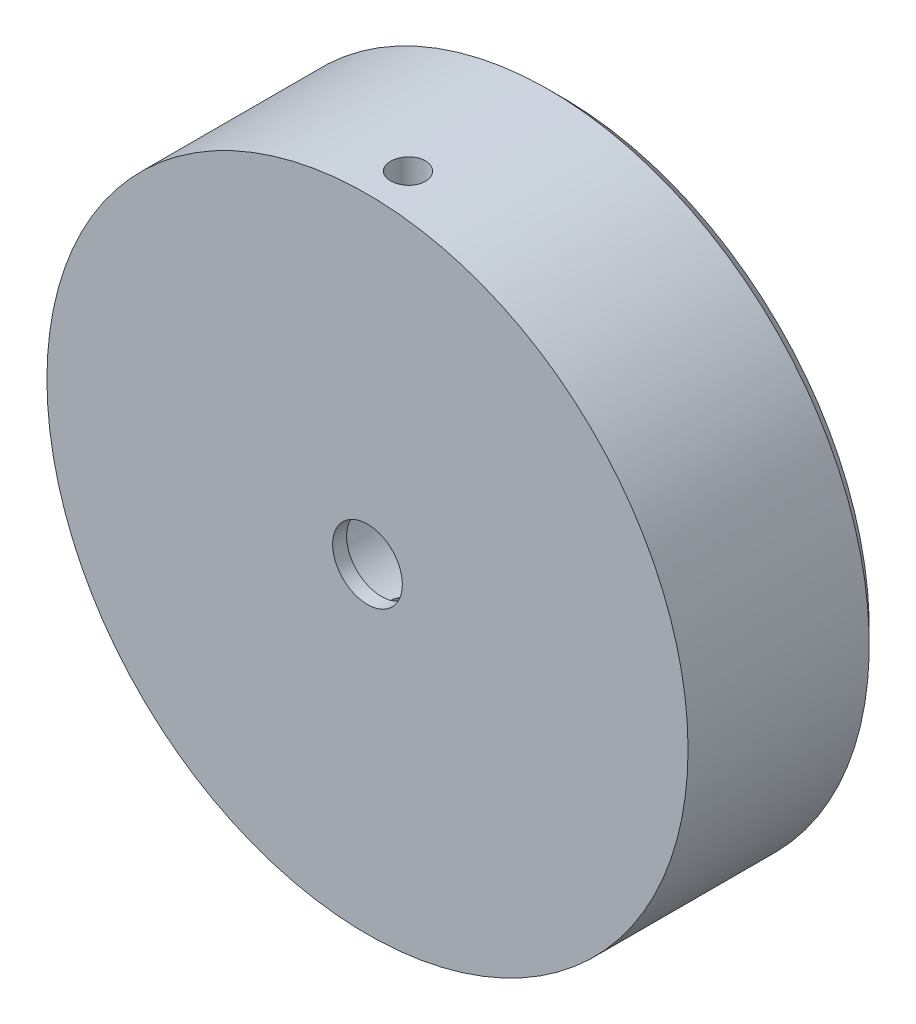
ISO-10303-21;
HEADER;
FILE_DESCRIPTION(('STEP AP214'),'2;1');
FILE_NAME('part.step','',(''),(''),'','','');
FILE_SCHEMA(('AUTOMOTIVE_DESIGN { 1 0 10303 214 1 1 1 1 }'));
ENDSEC;
DATA;
#1=APPLICATION_CONTEXT('core data for automotive mechanical design processes');
#2=APPLICATION_PROTOCOL_DEFINITION('international standard','automotive_design',2000,#1);
#3=PRODUCT_CONTEXT('',#1,'mechanical');
#4=PRODUCT('Part','Part','',(#3));
#5=PRODUCT_RELATED_PRODUCT_CATEGORY('part','',(#4));
#6=PRODUCT_DEFINITION_FORMATION('','',#4);
#7=PRODUCT_DEFINITION_CONTEXT('part definition',#1,'design');
#8=PRODUCT_DEFINITION('design','',#6,#7);
#9=PRODUCT_DEFINITION_SHAPE('','',#8);
#10=(LENGTH_UNIT() NAMED_UNIT(*) SI_UNIT(.MILLI.,.METRE.));
#11=(NAMED_UNIT(*) PLANE_ANGLE_UNIT() SI_UNIT($,.RADIAN.));
#12=(NAMED_UNIT(*) SI_UNIT($,.STERADIAN.) SOLID_ANGLE_UNIT());
#13=UNCERTAINTY_MEASURE_WITH_UNIT(LENGTH_MEASURE(1.E-05),#10,'distance_accuracy_value','');
#14=(GEOMETRIC_REPRESENTATION_CONTEXT(3) GLOBAL_UNCERTAINTY_ASSIGNED_CONTEXT((#13)) GLOBAL_UNIT_ASSIGNED_CONTEXT((#10,
#11,#12)) REPRESENTATION_CONTEXT('',''));
#15=CARTESIAN_POINT('',(0.,0.,0.));
#16=DIRECTION('',(0.,0.,1.));
#17=DIRECTION('',(1.,0.,0.));
#18=AXIS2_PLACEMENT_3D('',#15,#16,#17);
#19=CARTESIAN_POINT('',(0.,0.,11.));
#20=DIRECTION('',(0.,0.,-1.));
#21=DIRECTION('',(-1.,0.,0.));
#22=AXIS2_PLACEMENT_3D('',#19,#20,#21);
#23=CYLINDRICAL_SURFACE('',#22,23.);
#24=CARTESIAN_POINT('',(0.,0.,2.99999999999999));
#25=DIRECTION('',(0.,0.,-1.));
#26=DIRECTION('',(-1.,0.,0.));
#27=AXIS2_PLACEMENT_3D('',#24,#25,#26);
#28=CIRCLE('',#27,23.);
#29=CARTESIAN_POINT('',(-23.,0.,2.99999999999999));
#30=VERTEX_POINT('',#29);
#31=EDGE_CURVE('E12',#30,#30,#28,.F.);
#32=ORIENTED_EDGE('',*,*,#31,.T.);
#33=EDGE_LOOP('',(#32));
#34=FACE_BOUND('',#33,.T.);
#35=CARTESIAN_POINT('',(0.,0.,16.));
#36=DIRECTION('',(0.,0.,1.));
#37=DIRECTION('',(1.,0.,0.));
#38=AXIS2_PLACEMENT_3D('',#35,#36,#37);
#39=CIRCLE('',#38,23.);
#40=CARTESIAN_POINT('',(23.,0.,16.));
#41=VERTEX_POINT('',#40);
#42=EDGE_CURVE('E141',#41,#41,#39,.T.);
#43=ORIENTED_EDGE('',*,*,#42,.F.);
#44=EDGE_LOOP('',(#43));
#45=FACE_BOUND('',#44,.T.);
#46=CARTESIAN_POINT('',(0.,-23.,11.8479699702179));
#47=CARTESIAN_POINT('',(0.070157484148959,-22.9999995464798,11.8479730635431));
#48=CARTESIAN_POINT('',(0.140364518759939,-22.9996755589126,11.8538962981178));
#49=CARTESIAN_POINT('',(0.278841240028029,-22.9984142553928,11.8774409256666));
#50=CARTESIAN_POINT('',(0.347108554823027,-22.9974762196496,11.8950760477327));
#51=CARTESIAN_POINT('',(0.479679867000617,-22.9950929726235,11.9415375250609));
#52=CARTESIAN_POINT('',(0.543985887337103,-22.9936480227785,11.9703581122998));
#53=CARTESIAN_POINT('',(0.666830155204635,-22.9904136128434,12.0383633866012));
#54=CARTESIAN_POINT('',(0.725369746776151,-22.9886242333216,12.0775456506792));
#55=CARTESIAN_POINT('',(0.835105010414246,-22.984899870737,12.165212645164));
#56=CARTESIAN_POINT('',(0.886293095608879,-22.9829647403515,12.2137068667778));
#57=CARTESIAN_POINT('',(0.97980756118481,-22.9791682426283,12.3186020031588));
#58=CARTESIAN_POINT('',(1.02213357692234,-22.9773068783285,12.3750032431132));
#59=CARTESIAN_POINT('',(1.09674434145684,-22.9738667342574,12.494152476474));
#60=CARTESIAN_POINT('',(1.12902301234937,-22.9722881257768,12.5569042812118));
#61=CARTESIAN_POINT('',(1.18258386460404,-22.9695933512824,12.686946563381));
#62=CARTESIAN_POINT('',(1.20386614062167,-22.968477181288,12.7542370017389));
#63=CARTESIAN_POINT('',(1.2348096206966,-22.9668345138149,12.8913752762186));
#64=CARTESIAN_POINT('',(1.24448239520072,-22.9663074292687,12.961220494474));
#65=CARTESIAN_POINT('',(1.25196800352087,-22.9659006105696,13.101545098867));
#66=CARTESIAN_POINT('',(1.24978094406138,-22.9660208705914,13.1720244792922));
#67=CARTESIAN_POINT('',(1.23361859128318,-22.9668946339903,13.3115380493633));
#68=CARTESIAN_POINT('',(1.21965580515618,-22.9676474654998,13.3805736927323));
#69=CARTESIAN_POINT('',(1.18035773931093,-22.9697004661491,13.5153198078594));
#70=CARTESIAN_POINT('',(1.15502240504185,-22.9710006379143,13.5810302636658));
#71=CARTESIAN_POINT('',(1.0936841634433,-22.9740025589958,13.7073009849989));
#72=CARTESIAN_POINT('',(1.05767556314324,-22.9757045225233,13.7678584797655));
#73=CARTESIAN_POINT('',(0.976017080767247,-22.9793179911777,13.8820739744426));
#74=CARTESIAN_POINT('',(0.930367117623372,-22.9812294980663,13.935731916333));
#75=CARTESIAN_POINT('',(0.830651208817944,-22.9850496034949,14.0346979401261));
#76=CARTESIAN_POINT('',(0.776574434568219,-22.9869581950568,14.0799951123788));
#77=CARTESIAN_POINT('',(0.661577969763035,-22.990554978932,14.1608696828906));
#78=CARTESIAN_POINT('',(0.600658277316931,-22.9922431711843,14.1964470784642));
#79=CARTESIAN_POINT('',(0.473698803858477,-22.9952089963558,14.2568711781009));
#80=CARTESIAN_POINT('',(0.407658836295339,-22.9964866143074,14.2817174909736));
#81=CARTESIAN_POINT('',(0.272336315232594,-22.9984870958115,14.319966948344));
#82=CARTESIAN_POINT('',(0.20305379039746,-22.9992099642671,14.3333701939792));
#83=CARTESIAN_POINT('',(0.0633075233962725,-23.0000188516756,14.3483395786199));
#84=CARTESIAN_POINT('',(-0.00715459808249097,-23.0001056823753,14.3499208055983));
#85=CARTESIAN_POINT('',(-0.147343141235634,-22.999634865247,14.3412406577781));
#86=CARTESIAN_POINT('',(-0.217069565791665,-22.9990772199444,14.330979329383));
#87=CARTESIAN_POINT('',(-0.353765087089873,-22.9973807719209,14.2989178417258));
#88=CARTESIAN_POINT('',(-0.420735806852417,-22.9962423167299,14.2771245823485));
#89=CARTESIAN_POINT('',(-0.550068894520411,-22.9935123926938,14.2226248623202));
#90=CARTESIAN_POINT('',(-0.612431231054715,-22.9919209207653,14.1899183273865));
#91=CARTESIAN_POINT('',(-0.730846533920104,-22.9884619056155,14.1144819164846));
#92=CARTESIAN_POINT('',(-0.786893056508578,-22.9865940848609,14.0717419384494));
#93=CARTESIAN_POINT('',(-0.891020961577482,-22.9827936046788,13.977466613902));
#94=CARTESIAN_POINT('',(-0.939102284167696,-22.9808609447639,13.9259312012629));
#95=CARTESIAN_POINT('',(-1.02598583528885,-22.9771462868055,13.8154629403814));
#96=CARTESIAN_POINT('',(-1.06477829332785,-22.975364448666,13.7565224015176));
#97=CARTESIAN_POINT('',(-1.13191614555514,-22.9721548918586,13.6329557838778));
#98=CARTESIAN_POINT('',(-1.16026159135892,-22.9707271714412,13.568329733194));
#99=CARTESIAN_POINT('',(-1.20568379685929,-22.9683879965291,13.4352626210364));
#100=CARTESIAN_POINT('',(-1.22276675962146,-22.9674762578852,13.3668236821618));
#101=CARTESIAN_POINT('',(-1.24519935494727,-22.9662710665535,13.2280438924908));
#102=CARTESIAN_POINT('',(-1.25054907016681,-22.9659776095101,13.1577030550959));
#103=CARTESIAN_POINT('',(-1.24936253251662,-22.9660421803842,13.0172134012241));
#104=CARTESIAN_POINT('',(-1.24284164639967,-22.9663993660308,12.9470644540574));
#105=CARTESIAN_POINT('',(-1.21813080658767,-22.9677231856448,12.8088589121025));
#106=CARTESIAN_POINT('',(-1.19994083097533,-22.9686898207569,12.7408023212445));
#107=CARTESIAN_POINT('',(-1.15241141740243,-22.97112340154,12.6087104814218));
#108=CARTESIAN_POINT('',(-1.1230719426703,-22.9725903488609,12.5446752457205));
#109=CARTESIAN_POINT('',(-1.05407879758938,-22.9758591860545,12.4224381592794));
#110=CARTESIAN_POINT('',(-1.01442542776099,-22.9776610661677,12.3642361386431));
#111=CARTESIAN_POINT('',(-0.925874304386517,-22.9813993783095,12.2552403683848));
#112=CARTESIAN_POINT('',(-0.876965669474566,-22.9833359670021,12.2044554648225));
#113=CARTESIAN_POINT('',(-0.77130272596322,-22.9871242361953,12.1118006467427));
#114=CARTESIAN_POINT('',(-0.714546493642686,-22.9889758957282,12.0699329245512));
#115=CARTESIAN_POINT('',(-0.594748474144665,-22.9923871406833,11.9962777614475));
#116=CARTESIAN_POINT('',(-0.531700165038708,-22.993946418122,11.9645009257112));
#117=CARTESIAN_POINT('',(-0.401201499798105,-22.9965927668707,11.9120221692196));
#118=CARTESIAN_POINT('',(-0.333756434717351,-22.9976803941239,11.8913072029201));
#119=CARTESIAN_POINT('',(-0.221578649753999,-22.9989740712893,11.8669578080453));
#120=CARTESIAN_POINT('',(-0.177572058070254,-22.9993570976617,11.8598464970235));
#121=CARTESIAN_POINT('',(-0.0890502994617625,-22.9998702058327,11.8503515987181));
#122=CARTESIAN_POINT('',(-0.0445351330558327,-23.0000002878892,11.847968006612));
#123=CARTESIAN_POINT('',(0.,-23.,11.8479699702179));
#124=B_SPLINE_CURVE_WITH_KNOTS('',3,(#46,#47,#48,#49,#50,#51,#52,#53,#54,#55,#56,#57,#58,#59,
#60,#61,#62,#63,#64,#65,#66,#67,#68,#69,#70,#71,#72,#73,#74,#75,#76,#77,#78,#79,#80,#81,#82,#83,
#84,#85,#86,#87,#88,#89,#90,#91,#92,#93,#94,#95,#96,#97,#98,#99,#100,#101,#102,#103,#104,#105,
#106,#107,#108,#109,#110,#111,#112,#113,#114,#115,#116,#117,#118,#119,#120,#121,#122,#123),
.UNSPECIFIED.,.T.,.F.,(4,2,2,2,2,2,2,2,2,2,2,2,2,2,2,2,2,2,2,2,2,2,2,2,2,2,2,2,2,2,2,2,2,2,2,2,
2,2,4),(0.,0.210309879450779,0.420866727821661,0.631315142032036,0.841714388235875,
1.05232923309751,1.2629527423354,1.47370341679177,1.68445227710425,1.89499092264464,
2.10552767358922,2.31584109121604,2.52615551766636,2.73658232537182,2.94701090248965,
3.15771214810814,3.36841345194191,3.57912243602345,3.78982955777188,4.00026771640958,
4.21070505047605,4.42101661598779,4.63132961304446,4.84185527665562,5.05238252313414,
5.2631302493966,5.47387693440499,5.68450744875617,5.8951364792973,6.10549303982836,
6.31584999545914,6.52620764486259,6.73655916567092,6.94715954967004,7.15781165103341,
7.36868441340688,7.57930793585165,7.71281027180174,7.84631247157291),.UNSPECIFIED.);
#125=CARTESIAN_POINT('',(0.,-23.,11.8479699702179));
#126=VERTEX_POINT('',#125);
#127=EDGE_CURVE('E96',#126,#126,#124,.T.);
#128=ORIENTED_EDGE('',*,*,#127,.F.);
#129=EDGE_LOOP('',(#128));
#130=FACE_BOUND('',#129,.T.);
#131=CARTESIAN_POINT('',(0.,23.,11.8479699702179));
#132=CARTESIAN_POINT('',(-0.070157484148959,22.9999995464798,11.8479730635431));
#133=CARTESIAN_POINT('',(-0.140364518759939,22.9996755589126,11.8538962981178));
#134=CARTESIAN_POINT('',(-0.278841240028029,22.9984142553928,11.8774409256666));
#135=CARTESIAN_POINT('',(-0.347108554823027,22.9974762196496,11.8950760477327));
#136=CARTESIAN_POINT('',(-0.479679867000617,22.9950929726235,11.9415375250609));
#137=CARTESIAN_POINT('',(-0.543985887337103,22.9936480227785,11.9703581122998));
#138=CARTESIAN_POINT('',(-0.666830155204635,22.9904136128434,12.0383633866012));
#139=CARTESIAN_POINT('',(-0.725369746776151,22.9886242333216,12.0775456506792));
#140=CARTESIAN_POINT('',(-0.835105010414246,22.984899870737,12.165212645164));
#141=CARTESIAN_POINT('',(-0.886293095608879,22.9829647403515,12.2137068667778));
#142=CARTESIAN_POINT('',(-0.97980756118481,22.9791682426283,12.3186020031588));
#143=CARTESIAN_POINT('',(-1.02213357692234,22.9773068783285,12.3750032431132));
#144=CARTESIAN_POINT('',(-1.09674434145684,22.9738667342574,12.494152476474));
#145=CARTESIAN_POINT('',(-1.12902301234937,22.9722881257768,12.5569042812118));
#146=CARTESIAN_POINT('',(-1.18258386460404,22.9695933512824,12.686946563381));
#147=CARTESIAN_POINT('',(-1.20386614062167,22.968477181288,12.7542370017389));
#148=CARTESIAN_POINT('',(-1.2348096206966,22.9668345138149,12.8913752762186));
#149=CARTESIAN_POINT('',(-1.24448239520072,22.9663074292687,12.961220494474));
#150=CARTESIAN_POINT('',(-1.25196800352087,22.9659006105696,13.101545098867));
#151=CARTESIAN_POINT('',(-1.24978094406138,22.9660208705914,13.1720244792922));
#152=CARTESIAN_POINT('',(-1.23361859128318,22.9668946339903,13.3115380493633));
#153=CARTESIAN_POINT('',(-1.21965580515618,22.9676474654998,13.3805736927323));
#154=CARTESIAN_POINT('',(-1.18035773931093,22.9697004661491,13.5153198078594));
#155=CARTESIAN_POINT('',(-1.15502240504185,22.9710006379143,13.5810302636658));
#156=CARTESIAN_POINT('',(-1.0936841634433,22.9740025589958,13.7073009849989));
#157=CARTESIAN_POINT('',(-1.05767556314324,22.9757045225233,13.7678584797655));
#158=CARTESIAN_POINT('',(-0.976017080767247,22.9793179911777,13.8820739744426));
#159=CARTESIAN_POINT('',(-0.930367117623372,22.9812294980663,13.935731916333));
#160=CARTESIAN_POINT('',(-0.830651208817944,22.9850496034949,14.0346979401261));
#161=CARTESIAN_POINT('',(-0.776574434568219,22.9869581950568,14.0799951123788));
#162=CARTESIAN_POINT('',(-0.661577969763035,22.990554978932,14.1608696828906));
#163=CARTESIAN_POINT('',(-0.600658277316931,22.9922431711843,14.1964470784642));
#164=CARTESIAN_POINT('',(-0.473698803858477,22.9952089963558,14.2568711781009));
#165=CARTESIAN_POINT('',(-0.407658836295339,22.9964866143074,14.2817174909736));
#166=CARTESIAN_POINT('',(-0.272336315232594,22.9984870958115,14.319966948344));
#167=CARTESIAN_POINT('',(-0.20305379039746,22.9992099642671,14.3333701939792));
#168=CARTESIAN_POINT('',(-0.0633075233962725,23.0000188516756,14.3483395786199));
#169=CARTESIAN_POINT('',(0.00715459808249097,23.0001056823753,14.3499208055983));
#170=CARTESIAN_POINT('',(0.147343141235634,22.999634865247,14.3412406577781));
#171=CARTESIAN_POINT('',(0.217069565791665,22.9990772199444,14.330979329383));
#172=CARTESIAN_POINT('',(0.353765087089873,22.9973807719209,14.2989178417258));
#173=CARTESIAN_POINT('',(0.420735806852417,22.9962423167299,14.2771245823485));
#174=CARTESIAN_POINT('',(0.550068894520411,22.9935123926938,14.2226248623202));
#175=CARTESIAN_POINT('',(0.612431231054715,22.9919209207653,14.1899183273865));
#176=CARTESIAN_POINT('',(0.730846533920104,22.9884619056155,14.1144819164846));
#177=CARTESIAN_POINT('',(0.786893056508578,22.9865940848609,14.0717419384494));
#178=CARTESIAN_POINT('',(0.891020961577482,22.9827936046788,13.977466613902));
#179=CARTESIAN_POINT('',(0.939102284167696,22.9808609447639,13.9259312012629));
#180=CARTESIAN_POINT('',(1.02598583528885,22.9771462868055,13.8154629403814));
#181=CARTESIAN_POINT('',(1.06477829332785,22.975364448666,13.7565224015176));
#182=CARTESIAN_POINT('',(1.13191614555514,22.9721548918586,13.6329557838778));
#183=CARTESIAN_POINT('',(1.16026159135892,22.9707271714412,13.568329733194));
#184=CARTESIAN_POINT('',(1.20568379685929,22.9683879965291,13.4352626210364));
#185=CARTESIAN_POINT('',(1.22276675962146,22.9674762578852,13.3668236821618));
#186=CARTESIAN_POINT('',(1.24519935494727,22.9662710665535,13.2280438924908));
#187=CARTESIAN_POINT('',(1.25054907016681,22.9659776095101,13.1577030550959));
#188=CARTESIAN_POINT('',(1.24936253251662,22.9660421803842,13.0172134012241));
#189=CARTESIAN_POINT('',(1.24284164639967,22.9663993660308,12.9470644540574));
#190=CARTESIAN_POINT('',(1.21813080658767,22.9677231856448,12.8088589121025));
#191=CARTESIAN_POINT('',(1.19994083097533,22.9686898207569,12.7408023212445));
#192=CARTESIAN_POINT('',(1.15241141740243,22.97112340154,12.6087104814218));
#193=CARTESIAN_POINT('',(1.1230719426703,22.9725903488609,12.5446752457205));
#194=CARTESIAN_POINT('',(1.05407879758938,22.9758591860545,12.4224381592794));
#195=CARTESIAN_POINT('',(1.01442542776099,22.9776610661677,12.3642361386431));
#196=CARTESIAN_POINT('',(0.925874304386517,22.9813993783095,12.2552403683848));
#197=CARTESIAN_POINT('',(0.876965669474566,22.9833359670021,12.2044554648225));
#198=CARTESIAN_POINT('',(0.77130272596322,22.9871242361953,12.1118006467427));
#199=CARTESIAN_POINT('',(0.714546493642686,22.9889758957282,12.0699329245512));
#200=CARTESIAN_POINT('',(0.594748474144665,22.9923871406833,11.9962777614475));
#201=CARTESIAN_POINT('',(0.531700165038708,22.993946418122,11.9645009257112));
#202=CARTESIAN_POINT('',(0.401201499798105,22.9965927668707,11.9120221692196));
#203=CARTESIAN_POINT('',(0.333756434717351,22.9976803941239,11.8913072029201));
#204=CARTESIAN_POINT('',(0.221578649753999,22.9989740712893,11.8669578080453));
#205=CARTESIAN_POINT('',(0.177572058070254,22.9993570976617,11.8598464970235));
#206=CARTESIAN_POINT('',(0.0890502994617625,22.9998702058327,11.8503515987181));
#207=CARTESIAN_POINT('',(0.0445351330558327,23.0000002878892,11.847968006612));
#208=CARTESIAN_POINT('',(0.,23.,11.8479699702179));
#209=B_SPLINE_CURVE_WITH_KNOTS('',3,(#131,#132,#133,#134,#135,#136,#137,#138,#139,#140,#141,
#142,#143,#144,#145,#146,#147,#148,#149,#150,#151,#152,#153,#154,#155,#156,#157,#158,#159,#160,
#161,#162,#163,#164,#165,#166,#167,#168,#169,#170,#171,#172,#173,#174,#175,#176,#177,#178,#179,
#180,#181,#182,#183,#184,#185,#186,#187,#188,#189,#190,#191,#192,#193,#194,#195,#196,#197,#198,
#199,#200,#201,#202,#203,#204,#205,#206,#207,#208),.UNSPECIFIED.,.T.,.F.,(4,2,2,2,2,2,2,2,2,2,2,
2,2,2,2,2,2,2,2,2,2,2,2,2,2,2,2,2,2,2,2,2,2,2,2,2,2,2,4),(0.,0.210309879450779,
0.420866727821661,0.631315142032036,0.841714388235875,1.05232923309751,1.2629527423354,
1.47370341679177,1.68445227710425,1.89499092264464,2.10552767358922,2.31584109121604,
2.52615551766636,2.73658232537182,2.94701090248965,3.15771214810814,3.36841345194191,
3.57912243602345,3.78982955777188,4.00026771640958,4.21070505047605,4.42101661598779,
4.63132961304446,4.84185527665562,5.05238252313414,5.2631302493966,5.47387693440499,
5.68450744875617,5.8951364792973,6.10549303982836,6.31584999545914,6.52620764486259,
6.73655916567092,6.94715954967004,7.15781165103341,7.36868441340688,7.57930793585165,
7.71281027180174,7.84631247157291),.UNSPECIFIED.);
#210=CARTESIAN_POINT('',(0.,23.,11.8479699702179));
#211=VERTEX_POINT('',#210);
#212=EDGE_CURVE('E102',#211,#211,#209,.T.);
#213=ORIENTED_EDGE('',*,*,#212,.F.);
#214=EDGE_LOOP('',(#213));
#215=FACE_BOUND('',#214,.T.);
#216=ADVANCED_FACE('F51',(#34,#45,#130,#215),#23,.T.);
#217=CARTESIAN_POINT('',(0.,0.,15.));
#218=DIRECTION('',(0.,0.,-1.));
#219=DIRECTION('',(-1.,0.,0.));
#220=AXIS2_PLACEMENT_3D('',#217,#218,#219);
#221=CYLINDRICAL_SURFACE('',#220,4.5);
#222=CARTESIAN_POINT('',(0.,0.,15.));
#223=DIRECTION('',(0.,0.,-1.));
#224=DIRECTION('',(-1.,0.,0.));
#225=AXIS2_PLACEMENT_3D('',#222,#223,#224);
#226=CIRCLE('',#225,4.5);
#227=CARTESIAN_POINT('',(-4.5,0.,15.));
#228=VERTEX_POINT('',#227);
#229=EDGE_CURVE('E137',#228,#228,#226,.T.);
#230=ORIENTED_EDGE('',*,*,#229,.F.);
#231=EDGE_LOOP('',(#230));
#232=FACE_BOUND('',#231,.T.);
#233=CARTESIAN_POINT('',(0.,0.,11.));
#234=DIRECTION('',(0.,0.,-1.));
#235=DIRECTION('',(-1.,0.,0.));
#236=AXIS2_PLACEMENT_3D('',#233,#234,#235);
#237=CIRCLE('',#236,4.5);
#238=CARTESIAN_POINT('',(-4.5,0.,11.));
#239=VERTEX_POINT('',#238);
#240=EDGE_CURVE('E144',#239,#239,#237,.T.);
#241=ORIENTED_EDGE('',*,*,#240,.T.);
#242=EDGE_LOOP('',(#241));
#243=FACE_BOUND('',#242,.T.);
#244=CARTESIAN_POINT('',(0.,-4.5,11.8479699702179));
#245=CARTESIAN_POINT('',(-0.0688012508831792,-4.49999908016929,11.8479713698031));
#246=CARTESIAN_POINT('',(-0.137617123752667,-4.49840674086833,11.8536692900232));
#247=CARTESIAN_POINT('',(-0.273259475994238,-4.49220950198236,11.8762656984832));
#248=CARTESIAN_POINT('',(-0.340085103663439,-4.48760333149253,11.8931689119316));
#249=CARTESIAN_POINT('',(-0.469769949680301,-4.47588565394594,11.9375786896318));
#250=CARTESIAN_POINT('',(-0.532634390095669,-4.46877753030964,11.9650709389163));
#251=CARTESIAN_POINT('',(-0.652860695241771,-4.45280312581996,12.0298234765448));
#252=CARTESIAN_POINT('',(-0.710222070812297,-4.44393668888688,12.0670846321372));
#253=CARTESIAN_POINT('',(-0.819246784715924,-4.4251515781749,12.1512994040608));
#254=CARTESIAN_POINT('',(-0.870753112808473,-4.41521373623696,12.1984520099055));
#255=CARTESIAN_POINT('',(-0.965238185696337,-4.39552607117256,12.3006862473395));
#256=CARTESIAN_POINT('',(-1.00821573084554,-4.38577627467018,12.3557689924931));
#257=CARTESIAN_POINT('',(-1.08520808580323,-4.36737044294547,12.4735772303472));
#258=CARTESIAN_POINT('',(-1.11903874947837,-4.35873847945984,12.5364271786616));
#259=CARTESIAN_POINT('',(-1.1755895713114,-4.34382900808304,12.667201887858));
#260=CARTESIAN_POINT('',(-1.19831197336242,-4.33755102474248,12.7351256206261));
#261=CARTESIAN_POINT('',(-1.23144924367956,-4.32825883142877,12.872372759072));
#262=CARTESIAN_POINT('',(-1.24215036904296,-4.32516886003198,12.9416217918578));
#263=CARTESIAN_POINT('',(-1.25183427077973,-4.32237649384804,13.0809958557807));
#264=CARTESIAN_POINT('',(-1.25081944027303,-4.3226734072502,13.1511207050991));
#265=CARTESIAN_POINT('',(-1.2373267133762,-4.32655366801453,13.2879922489406));
#266=CARTESIAN_POINT('',(-1.22519902270671,-4.33003660668585,13.3547767717141));
#267=CARTESIAN_POINT('',(-1.19038731201905,-4.33973517053475,13.4853235988095));
#268=CARTESIAN_POINT('',(-1.16770238457158,-4.3459510306134,13.5490856428202));
#269=CARTESIAN_POINT('',(-1.11214373134465,-4.36050069775752,13.6726722016732));
#270=CARTESIAN_POINT('',(-1.07915021836991,-4.36885918600197,13.732439837028));
#271=CARTESIAN_POINT('',(-1.00399440679635,-4.386739506843,13.8457115458092));
#272=CARTESIAN_POINT('',(-0.961830166290602,-4.39626158564316,13.8992142889441));
#273=CARTESIAN_POINT('',(-0.867755610284441,-4.41581072126827,14.0004338506543));
#274=CARTESIAN_POINT('',(-0.815552279702356,-4.42584370037791,14.0478776050978));
#275=CARTESIAN_POINT('',(-0.703806607201035,-4.44498199810829,14.1333957009957));
#276=CARTESIAN_POINT('',(-0.644263925421964,-4.45408727373461,14.1714696083204));
#277=CARTESIAN_POINT('',(-0.519083429338114,-4.47040839712755,14.237301785848));
#278=CARTESIAN_POINT('',(-0.453416395747747,-4.47761448645532,14.2650070741568));
#279=CARTESIAN_POINT('',(-0.318109988769715,-4.48925492501446,14.3089040686593));
#280=CARTESIAN_POINT('',(-0.248471564121131,-4.493689933237,14.3250985123745));
#281=CARTESIAN_POINT('',(-0.109526607713142,-4.49918736483408,14.3450771069969));
#282=CARTESIAN_POINT('',(-0.040277305858681,-4.5003505382403,14.3492321151251));
#283=CARTESIAN_POINT('',(0.0979299306365675,-4.49946480293159,14.3460429719255));
#284=CARTESIAN_POINT('',(0.166887897284519,-4.49741625678167,14.3387001185699));
#285=CARTESIAN_POINT('',(0.30120691347086,-4.49040265059029,14.3130266360983));
#286=CARTESIAN_POINT('',(0.366611288163866,-4.4854933716758,14.2949060251604));
#287=CARTESIAN_POINT('',(0.49344311811872,-4.47331829169354,14.2484381025798));
#288=CARTESIAN_POINT('',(0.554870123972382,-4.46605222488463,14.2200896376484));
#289=CARTESIAN_POINT('',(0.673420140405416,-4.44973740284175,14.1533040921714));
#290=CARTESIAN_POINT('',(0.730427061953542,-4.44065471340565,14.1146694458952));
#291=CARTESIAN_POINT('',(0.837277670587,-4.42175477128212,14.0286538344105));
#292=CARTESIAN_POINT('',(0.887119814631376,-4.41193736105189,13.9812709901522));
#293=CARTESIAN_POINT('',(0.979812026944952,-4.39229842684379,13.8773685263396));
#294=CARTESIAN_POINT('',(1.02239957885383,-4.3824860820796,13.8206125186603));
#295=CARTESIAN_POINT('',(1.09745581429008,-4.36429693304267,13.7005493323382));
#296=CARTESIAN_POINT('',(1.12992488482463,-4.35592007387163,13.6372424043753));
#297=CARTESIAN_POINT('',(1.18358105834153,-4.34164798956173,13.5061628003347));
#298=CARTESIAN_POINT('',(1.20483077484783,-4.3357390309604,13.4384173324633));
#299=CARTESIAN_POINT('',(1.23557652495357,-4.32707876892783,13.3001202608012));
#300=CARTESIAN_POINT('',(1.24507587906573,-4.32432657344887,13.2295694555848));
#301=CARTESIAN_POINT('',(1.25184859974322,-4.32237038329875,13.0903641907271));
#302=CARTESIAN_POINT('',(1.24954571014582,-4.32304340461176,13.021731780206));
#303=CARTESIAN_POINT('',(1.23377143287258,-4.32757137052124,12.8858750764232));
#304=CARTESIAN_POINT('',(1.22030038049411,-4.33142621959091,12.8186507409497));
#305=CARTESIAN_POINT('',(1.18282724248615,-4.34180718808003,12.6881027362999));
#306=CARTESIAN_POINT('',(1.15892214641117,-4.34830866913275,12.6247491275702));
#307=CARTESIAN_POINT('',(1.10133451670734,-4.36324916052054,12.5029025477106));
#308=CARTESIAN_POINT('',(1.06765033358688,-4.37168849767404,12.4444103987322));
#309=CARTESIAN_POINT('',(0.990206962020973,-4.38988810785379,12.3319423173927));
#310=CARTESIAN_POINT('',(0.946162084346267,-4.39968178982262,12.2781684935352));
#311=CARTESIAN_POINT('',(0.849781527450664,-4.41930831909363,12.1786375981645));
#312=CARTESIAN_POINT('',(0.797443795628191,-4.4291411755031,12.1328825173269));
#313=CARTESIAN_POINT('',(0.684460232307881,-4.44801839581548,12.0496118336398));
#314=CARTESIAN_POINT('',(0.623646258932174,-4.45703841192792,12.0123183469072));
#315=CARTESIAN_POINT('',(0.496361982692841,-4.47299974900605,11.9485418309284));
#316=CARTESIAN_POINT('',(0.429895030176725,-4.47994229035335,11.9220524516369));
#317=CARTESIAN_POINT('',(0.3031454837667,-4.4901607483195,11.8837498894832));
#318=CARTESIAN_POINT('',(0.243364402168741,-4.49382245661855,11.870365182625));
#319=CARTESIAN_POINT('',(0.122392625693409,-4.49874234976285,11.8524751243954));
#320=CARTESIAN_POINT('',(0.0612020980194152,-4.50000081823467,11.847968725218));
#321=CARTESIAN_POINT('',(0.,-4.5,11.8479699702179));
#322=B_SPLINE_CURVE_WITH_KNOTS('',3,(#244,#245,#246,#247,#248,#249,#250,#251,#252,#253,#254,
#255,#256,#257,#258,#259,#260,#261,#262,#263,#264,#265,#266,#267,#268,#269,#270,#271,#272,#273,
#274,#275,#276,#277,#278,#279,#280,#281,#282,#283,#284,#285,#286,#287,#288,#289,#290,#291,#292,
#293,#294,#295,#296,#297,#298,#299,#300,#301,#302,#303,#304,#305,#306,#307,#308,#309,#310,#311,
#312,#313,#314,#315,#316,#317,#318,#319,#320,#321),.UNSPECIFIED.,.T.,.F.,(4,2,2,2,2,2,2,2,2,2,2,
2,2,2,2,2,2,2,2,2,2,2,2,2,2,2,2,2,2,2,2,2,2,2,2,2,2,2,4),(0.,0.20617919309949,0.41244538614726,
0.618433707942853,0.824440322837931,1.03507624325264,1.24574177043995,1.46037690323672,
1.67496866133384,1.88433431939189,2.09365721284144,2.29660232990422,2.49956489399153,
2.70497960040655,2.91043784592675,3.12319493838162,3.33596188658146,3.5498016563595,
3.76359055350007,3.97072010588426,4.17782627748477,4.38102317477486,4.58424299163039,
4.79168948884226,4.99918059600964,5.21305991702851,5.426931056682,5.63959564853972,
5.85220013017267,6.05722599244307,6.26224569952548,6.46539893556025,6.66858645848129,
6.8782191327377,7.0879037754062,7.30258090584733,7.51713167871718,7.7005598652503,
7.88396640253934),.UNSPECIFIED.);
#323=CARTESIAN_POINT('',(0.,-4.5,11.8479699702179));
#324=VERTEX_POINT('',#323);
#325=EDGE_CURVE('E74',#324,#324,#322,.T.);
#326=ORIENTED_EDGE('',*,*,#325,.F.);
#327=EDGE_LOOP('',(#326));
#328=FACE_BOUND('',#327,.T.);
#329=CARTESIAN_POINT('',(0.,4.5,11.8479699702179));
#330=CARTESIAN_POINT('',(0.0688012508831792,4.49999908016929,11.8479713698031));
#331=CARTESIAN_POINT('',(0.137617123752667,4.49840674086833,11.8536692900232));
#332=CARTESIAN_POINT('',(0.273259475994238,4.49220950198236,11.8762656984832));
#333=CARTESIAN_POINT('',(0.340085103663439,4.48760333149253,11.8931689119316));
#334=CARTESIAN_POINT('',(0.469769949680301,4.47588565394594,11.9375786896318));
#335=CARTESIAN_POINT('',(0.532634390095669,4.46877753030964,11.9650709389163));
#336=CARTESIAN_POINT('',(0.652860695241771,4.45280312581996,12.0298234765448));
#337=CARTESIAN_POINT('',(0.710222070812297,4.44393668888688,12.0670846321372));
#338=CARTESIAN_POINT('',(0.819246784715924,4.4251515781749,12.1512994040608));
#339=CARTESIAN_POINT('',(0.870753112808473,4.41521373623696,12.1984520099055));
#340=CARTESIAN_POINT('',(0.965238185696337,4.39552607117256,12.3006862473395));
#341=CARTESIAN_POINT('',(1.00821573084554,4.38577627467018,12.3557689924931));
#342=CARTESIAN_POINT('',(1.08520808580323,4.36737044294547,12.4735772303472));
#343=CARTESIAN_POINT('',(1.11903874947837,4.35873847945984,12.5364271786616));
#344=CARTESIAN_POINT('',(1.1755895713114,4.34382900808304,12.667201887858));
#345=CARTESIAN_POINT('',(1.19831197336242,4.33755102474248,12.7351256206261));
#346=CARTESIAN_POINT('',(1.23144924367956,4.32825883142877,12.872372759072));
#347=CARTESIAN_POINT('',(1.24215036904296,4.32516886003198,12.9416217918578));
#348=CARTESIAN_POINT('',(1.25183427077973,4.32237649384804,13.0809958557807));
#349=CARTESIAN_POINT('',(1.25081944027303,4.3226734072502,13.1511207050991));
#350=CARTESIAN_POINT('',(1.2373267133762,4.32655366801453,13.2879922489406));
#351=CARTESIAN_POINT('',(1.22519902270671,4.33003660668585,13.3547767717141));
#352=CARTESIAN_POINT('',(1.19038731201905,4.33973517053475,13.4853235988095));
#353=CARTESIAN_POINT('',(1.16770238457158,4.3459510306134,13.5490856428202));
#354=CARTESIAN_POINT('',(1.11214373134465,4.36050069775752,13.6726722016732));
#355=CARTESIAN_POINT('',(1.07915021836991,4.36885918600197,13.732439837028));
#356=CARTESIAN_POINT('',(1.00399440679635,4.386739506843,13.8457115458092));
#357=CARTESIAN_POINT('',(0.961830166290602,4.39626158564316,13.8992142889441));
#358=CARTESIAN_POINT('',(0.867755610284441,4.41581072126827,14.0004338506543));
#359=CARTESIAN_POINT('',(0.815552279702356,4.42584370037791,14.0478776050978));
#360=CARTESIAN_POINT('',(0.703806607201035,4.44498199810829,14.1333957009957));
#361=CARTESIAN_POINT('',(0.644263925421964,4.45408727373461,14.1714696083204));
#362=CARTESIAN_POINT('',(0.519083429338114,4.47040839712755,14.237301785848));
#363=CARTESIAN_POINT('',(0.453416395747747,4.47761448645532,14.2650070741568));
#364=CARTESIAN_POINT('',(0.318109988769715,4.48925492501446,14.3089040686593));
#365=CARTESIAN_POINT('',(0.248471564121131,4.493689933237,14.3250985123745));
#366=CARTESIAN_POINT('',(0.109526607713142,4.49918736483408,14.3450771069969));
#367=CARTESIAN_POINT('',(0.040277305858681,4.5003505382403,14.3492321151251));
#368=CARTESIAN_POINT('',(-0.0979299306365675,4.49946480293159,14.3460429719255));
#369=CARTESIAN_POINT('',(-0.166887897284519,4.49741625678167,14.3387001185699));
#370=CARTESIAN_POINT('',(-0.30120691347086,4.49040265059029,14.3130266360983));
#371=CARTESIAN_POINT('',(-0.366611288163866,4.4854933716758,14.2949060251604));
#372=CARTESIAN_POINT('',(-0.49344311811872,4.47331829169354,14.2484381025798));
#373=CARTESIAN_POINT('',(-0.554870123972382,4.46605222488463,14.2200896376484));
#374=CARTESIAN_POINT('',(-0.673420140405416,4.44973740284175,14.1533040921714));
#375=CARTESIAN_POINT('',(-0.730427061953542,4.44065471340565,14.1146694458952));
#376=CARTESIAN_POINT('',(-0.837277670587,4.42175477128212,14.0286538344105));
#377=CARTESIAN_POINT('',(-0.887119814631376,4.41193736105189,13.9812709901522));
#378=CARTESIAN_POINT('',(-0.979812026944952,4.39229842684379,13.8773685263396));
#379=CARTESIAN_POINT('',(-1.02239957885383,4.3824860820796,13.8206125186603));
#380=CARTESIAN_POINT('',(-1.09745581429008,4.36429693304267,13.7005493323382));
#381=CARTESIAN_POINT('',(-1.12992488482463,4.35592007387163,13.6372424043753));
#382=CARTESIAN_POINT('',(-1.18358105834153,4.34164798956173,13.5061628003347));
#383=CARTESIAN_POINT('',(-1.20483077484783,4.3357390309604,13.4384173324633));
#384=CARTESIAN_POINT('',(-1.23557652495357,4.32707876892783,13.3001202608012));
#385=CARTESIAN_POINT('',(-1.24507587906573,4.32432657344887,13.2295694555848));
#386=CARTESIAN_POINT('',(-1.25184859974322,4.32237038329875,13.0903641907271));
#387=CARTESIAN_POINT('',(-1.24954571014582,4.32304340461176,13.021731780206));
#388=CARTESIAN_POINT('',(-1.23377143287258,4.32757137052124,12.8858750764232));
#389=CARTESIAN_POINT('',(-1.22030038049411,4.33142621959091,12.8186507409497));
#390=CARTESIAN_POINT('',(-1.18282724248615,4.34180718808003,12.6881027362999));
#391=CARTESIAN_POINT('',(-1.15892214641117,4.34830866913275,12.6247491275702));
#392=CARTESIAN_POINT('',(-1.10133451670734,4.36324916052054,12.5029025477106));
#393=CARTESIAN_POINT('',(-1.06765033358688,4.37168849767404,12.4444103987322));
#394=CARTESIAN_POINT('',(-0.990206962020973,4.38988810785379,12.3319423173927));
#395=CARTESIAN_POINT('',(-0.946162084346267,4.39968178982262,12.2781684935352));
#396=CARTESIAN_POINT('',(-0.849781527450664,4.41930831909363,12.1786375981645));
#397=CARTESIAN_POINT('',(-0.797443795628191,4.4291411755031,12.1328825173269));
#398=CARTESIAN_POINT('',(-0.684460232307881,4.44801839581548,12.0496118336398));
#399=CARTESIAN_POINT('',(-0.623646258932174,4.45703841192792,12.0123183469072));
#400=CARTESIAN_POINT('',(-0.496361982692841,4.47299974900605,11.9485418309284));
#401=CARTESIAN_POINT('',(-0.429895030176725,4.47994229035335,11.9220524516369));
#402=CARTESIAN_POINT('',(-0.3031454837667,4.4901607483195,11.8837498894832));
#403=CARTESIAN_POINT('',(-0.243364402168741,4.49382245661855,11.870365182625));
#404=CARTESIAN_POINT('',(-0.122392625693409,4.49874234976285,11.8524751243954));
#405=CARTESIAN_POINT('',(-0.0612020980194152,4.50000081823467,11.847968725218));
#406=CARTESIAN_POINT('',(0.,4.5,11.8479699702179));
#407=B_SPLINE_CURVE_WITH_KNOTS('',3,(#329,#330,#331,#332,#333,#334,#335,#336,#337,#338,#339,
#340,#341,#342,#343,#344,#345,#346,#347,#348,#349,#350,#351,#352,#353,#354,#355,#356,#357,#358,
#359,#360,#361,#362,#363,#364,#365,#366,#367,#368,#369,#370,#371,#372,#373,#374,#375,#376,#377,
#378,#379,#380,#381,#382,#383,#384,#385,#386,#387,#388,#389,#390,#391,#392,#393,#394,#395,#396,
#397,#398,#399,#400,#401,#402,#403,#404,#405,#406),.UNSPECIFIED.,.T.,.F.,(4,2,2,2,2,2,2,2,2,2,2,
2,2,2,2,2,2,2,2,2,2,2,2,2,2,2,2,2,2,2,2,2,2,2,2,2,2,2,4),(0.,0.20617919309949,0.41244538614726,
0.618433707942853,0.824440322837931,1.03507624325264,1.24574177043995,1.46037690323672,
1.67496866133384,1.88433431939189,2.09365721284144,2.29660232990422,2.49956489399153,
2.70497960040655,2.91043784592675,3.12319493838162,3.33596188658146,3.5498016563595,
3.76359055350007,3.97072010588426,4.17782627748477,4.38102317477486,4.58424299163039,
4.79168948884226,4.99918059600964,5.21305991702851,5.426931056682,5.63959564853972,
5.85220013017267,6.05722599244307,6.26224569952548,6.46539893556025,6.66858645848129,
6.8782191327377,7.0879037754062,7.30258090584733,7.51713167871718,7.7005598652503,
7.88396640253934),.UNSPECIFIED.);
#408=CARTESIAN_POINT('',(0.,4.5,11.8479699702179));
#409=VERTEX_POINT('',#408);
#410=EDGE_CURVE('E55',#409,#409,#407,.T.);
#411=ORIENTED_EDGE('',*,*,#410,.F.);
#412=EDGE_LOOP('',(#411));
#413=FACE_BOUND('',#412,.T.);
#414=ADVANCED_FACE('F80',(#232,#243,#328,#413),#221,.F.);
#415=CARTESIAN_POINT('',(0.,0.,11.));
#416=DIRECTION('',(0.,0.,-1.));
#417=DIRECTION('',(-1.,0.,0.));
#418=AXIS2_PLACEMENT_3D('',#415,#416,#417);
#419=CYLINDRICAL_SURFACE('',#418,13.905);
#420=CARTESIAN_POINT('',(0.,0.,11.));
#421=DIRECTION('',(0.,0.,1.));
#422=DIRECTION('',(1.,0.,0.));
#423=AXIS2_PLACEMENT_3D('',#420,#421,#422);
#424=CIRCLE('',#423,13.905);
#425=CARTESIAN_POINT('',(13.905,0.,11.));
#426=VERTEX_POINT('',#425);
#427=EDGE_CURVE('E71',#426,#426,#424,.T.);
#428=ORIENTED_EDGE('',*,*,#427,.T.);
#429=EDGE_LOOP('',(#428));
#430=FACE_BOUND('',#429,.T.);
#431=CARTESIAN_POINT('',(0.,0.,2.));
#432=DIRECTION('',(0.,0.,-1.));
#433=DIRECTION('',(-1.,0.,0.));
#434=AXIS2_PLACEMENT_3D('',#431,#432,#433);
#435=CIRCLE('',#434,13.905);
#436=CARTESIAN_POINT('',(-13.905,0.,2.));
#437=VERTEX_POINT('',#436);
#438=EDGE_CURVE('E147',#437,#437,#435,.T.);
#439=ORIENTED_EDGE('',*,*,#438,.T.);
#440=EDGE_LOOP('',(#439));
#441=FACE_BOUND('',#440,.T.);
#442=ADVANCED_FACE('F110',(#430,#441),#419,.F.);
#443=CARTESIAN_POINT('',(0.,0.,-2.00000000000001));
#444=DIRECTION('',(0.,0.,1.));
#445=DIRECTION('',(1.,0.,0.));
#446=AXIS2_PLACEMENT_3D('',#443,#444,#445);
#447=CYLINDRICAL_SURFACE('',#446,2.5);
#448=CARTESIAN_POINT('',(0.,0.,16.));
#449=DIRECTION('',(0.,0.,1.));
#450=DIRECTION('',(1.,0.,0.));
#451=AXIS2_PLACEMENT_3D('',#448,#449,#450);
#452=CIRCLE('',#451,2.5);
#453=CARTESIAN_POINT('',(2.5,0.,16.));
#454=VERTEX_POINT('',#453);
#455=EDGE_CURVE('E131',#454,#454,#452,.T.);
#456=ORIENTED_EDGE('',*,*,#455,.T.);
#457=EDGE_LOOP('',(#456));
#458=FACE_BOUND('',#457,.T.);
#459=CARTESIAN_POINT('',(0.,0.,15.));
#460=DIRECTION('',(0.,0.,-1.));
#461=DIRECTION('',(-1.,0.,0.));
#462=AXIS2_PLACEMENT_3D('',#459,#460,#461);
#463=CIRCLE('',#462,2.5);
#464=CARTESIAN_POINT('',(-2.5,0.,15.));
#465=VERTEX_POINT('',#464);
#466=EDGE_CURVE('E134',#465,#465,#463,.F.);
#467=ORIENTED_EDGE('',*,*,#466,.F.);
#468=EDGE_LOOP('',(#467));
#469=FACE_BOUND('',#468,.T.);
#470=ADVANCED_FACE('F114',(#458,#469),#447,.F.);
#471=CARTESIAN_POINT('',(0.,0.,11.));
#472=DIRECTION('',(0.,0.,1.));
#473=DIRECTION('',(1.,0.,0.));
#474=AXIS2_PLACEMENT_3D('',#471,#472,#473);
#475=PLANE('',#474);
#476=ORIENTED_EDGE('',*,*,#240,.F.);
#477=EDGE_LOOP('',(#476));
#478=FACE_BOUND('',#477,.T.);
#479=ORIENTED_EDGE('',*,*,#427,.F.);
#480=EDGE_LOOP('',(#479));
#481=FACE_BOUND('',#480,.T.);
#482=ADVANCED_FACE('F116',(#478,#481),#475,.F.);
#483=CARTESIAN_POINT('',(0.,0.,16.));
#484=DIRECTION('',(0.,0.,1.));
#485=DIRECTION('',(1.,0.,0.));
#486=AXIS2_PLACEMENT_3D('',#483,#484,#485);
#487=PLANE('',#486);
#488=ORIENTED_EDGE('',*,*,#455,.F.);
#489=EDGE_LOOP('',(#488));
#490=FACE_BOUND('',#489,.T.);
#491=ORIENTED_EDGE('',*,*,#42,.T.);
#492=EDGE_LOOP('',(#491));
#493=FACE_BOUND('',#492,.T.);
#494=ADVANCED_FACE('F119',(#490,#493),#487,.T.);
#495=CARTESIAN_POINT('',(0.,0.,15.));
#496=DIRECTION('',(0.,0.,-1.));
#497=DIRECTION('',(-1.,0.,0.));
#498=AXIS2_PLACEMENT_3D('',#495,#496,#497);
#499=PLANE('',#498);
#500=ORIENTED_EDGE('',*,*,#229,.T.);
#501=EDGE_LOOP('',(#500));
#502=FACE_BOUND('',#501,.T.);
#503=ORIENTED_EDGE('',*,*,#466,.T.);
#504=EDGE_LOOP('',(#503));
#505=FACE_BOUND('',#504,.T.);
#506=ADVANCED_FACE('F122',(#502,#505),#499,.T.);
#507=CARTESIAN_POINT('',(0.,0.,2.));
#508=DIRECTION('',(0.,0.,-1.));
#509=DIRECTION('',(-1.,0.,0.));
#510=AXIS2_PLACEMENT_3D('',#507,#508,#509);
#511=PLANE('',#510);
#512=CARTESIAN_POINT('',(0.,0.,2.));
#513=DIRECTION('',(0.,0.,-1.));
#514=DIRECTION('',(-1.,0.,0.));
#515=AXIS2_PLACEMENT_3D('',#512,#513,#514);
#516=CIRCLE('',#515,22.);
#517=CARTESIAN_POINT('',(-22.,0.,2.));
#518=VERTEX_POINT('',#517);
#519=EDGE_CURVE('E65',#518,#518,#516,.T.);
#520=ORIENTED_EDGE('',*,*,#519,.T.);
#521=EDGE_LOOP('',(#520));
#522=FACE_BOUND('',#521,.T.);
#523=ORIENTED_EDGE('',*,*,#438,.F.);
#524=EDGE_LOOP('',(#523));
#525=FACE_BOUND('',#524,.T.);
#526=ADVANCED_FACE('F90',(#522,#525),#511,.T.);
#527=CARTESIAN_POINT('',(0.,0.,2.));
#528=DIRECTION('',(0.,0.,1.));
#529=DIRECTION('',(1.,0.,0.));
#530=AXIS2_PLACEMENT_3D('',#527,#528,#529);
#531=CONICAL_SURFACE('',#530,22.,0.785398163397445);
#532=ORIENTED_EDGE('',*,*,#31,.F.);
#533=EDGE_LOOP('',(#532));
#534=FACE_BOUND('',#533,.T.);
#535=ORIENTED_EDGE('',*,*,#519,.F.);
#536=EDGE_LOOP('',(#535));
#537=FACE_BOUND('',#536,.T.);
#538=ADVANCED_FACE('F53',(#534,#537),#531,.T.);
#539=CARTESIAN_POINT('',(0.,30.,13.0979699702179));
#540=DIRECTION('',(0.,-1.,0.));
#541=DIRECTION('',(0.,0.,-1.));
#542=AXIS2_PLACEMENT_3D('',#539,#540,#541);
#543=CYLINDRICAL_SURFACE('',#542,1.25);
#544=ORIENTED_EDGE('',*,*,#325,.T.);
#545=EDGE_LOOP('',(#544));
#546=FACE_BOUND('',#545,.T.);
#547=ORIENTED_EDGE('',*,*,#127,.T.);
#548=EDGE_LOOP('',(#547));
#549=FACE_BOUND('',#548,.T.);
#550=ADVANCED_FACE('F88',(#546,#549),#543,.F.);
#551=ORIENTED_EDGE('',*,*,#410,.T.);
#552=EDGE_LOOP('',(#551));
#553=FACE_BOUND('',#552,.T.);
#554=ORIENTED_EDGE('',*,*,#212,.T.);
#555=EDGE_LOOP('',(#554));
#556=FACE_BOUND('',#555,.T.);
#557=ADVANCED_FACE('F84',(#553,#556),#543,.F.);
#558=CLOSED_SHELL('',(#216,#414,#442,#470,#482,#494,#506,#526,#538,#550,#557));
#559=MANIFOLD_SOLID_BREP('B2',#558);
#560=ADVANCED_BREP_SHAPE_REPRESENTATION('',(#18,#559),#14);
#561=SHAPE_DEFINITION_REPRESENTATION(#9,#560);
ENDSEC;
END-ISO-10303-21;
